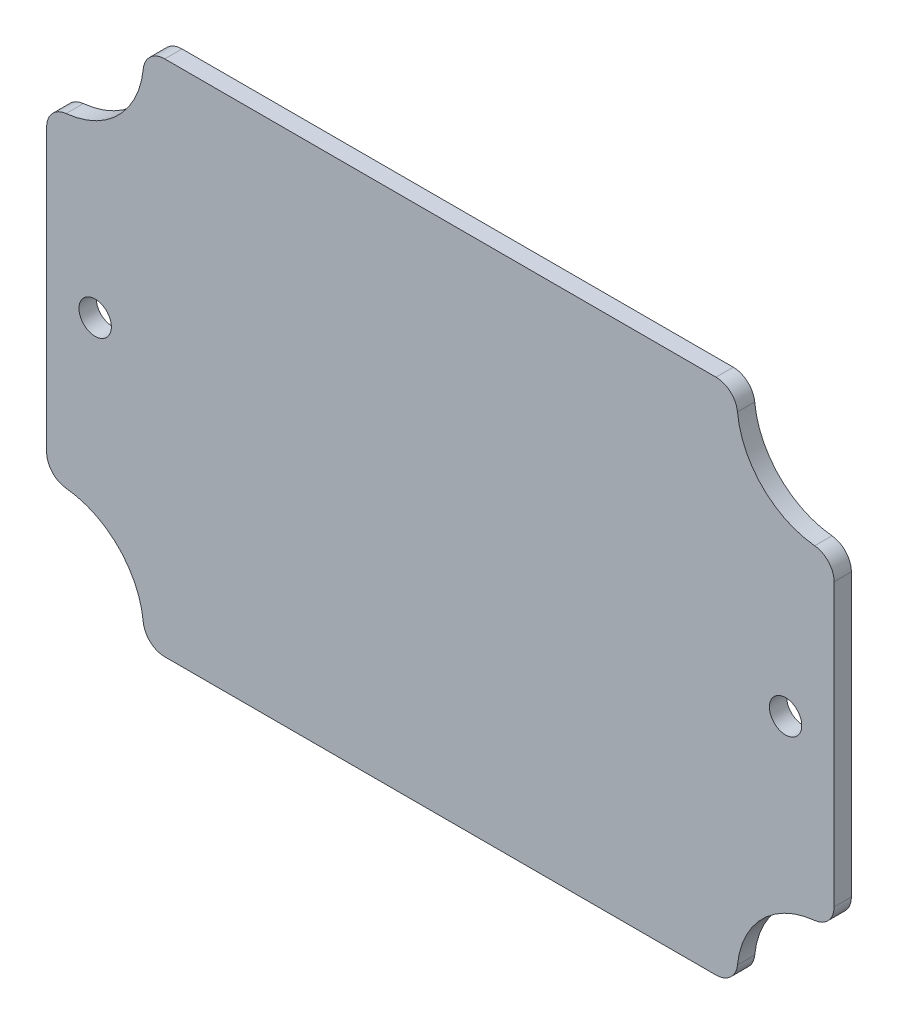
ISO-10303-21;
HEADER;
FILE_DESCRIPTION(('STEP AP214'),'2;1');
FILE_NAME('part.step','',(''),(''),'','','');
FILE_SCHEMA(('AUTOMOTIVE_DESIGN { 1 0 10303 214 1 1 1 1 }'));
ENDSEC;
DATA;
#1=APPLICATION_CONTEXT('core data for automotive mechanical design processes');
#2=APPLICATION_PROTOCOL_DEFINITION('international standard','automotive_design',2000,#1);
#3=PRODUCT_CONTEXT('',#1,'mechanical');
#4=PRODUCT('Part','Part','',(#3));
#5=PRODUCT_RELATED_PRODUCT_CATEGORY('part','',(#4));
#6=PRODUCT_DEFINITION_FORMATION('','',#4);
#7=PRODUCT_DEFINITION_CONTEXT('part definition',#1,'design');
#8=PRODUCT_DEFINITION('design','',#6,#7);
#9=PRODUCT_DEFINITION_SHAPE('','',#8);
#10=(LENGTH_UNIT() NAMED_UNIT(*) SI_UNIT(.MILLI.,.METRE.));
#11=(NAMED_UNIT(*) PLANE_ANGLE_UNIT() SI_UNIT($,.RADIAN.));
#12=(NAMED_UNIT(*) SI_UNIT($,.STERADIAN.) SOLID_ANGLE_UNIT());
#13=UNCERTAINTY_MEASURE_WITH_UNIT(LENGTH_MEASURE(1.E-05),#10,'distance_accuracy_value','');
#14=(GEOMETRIC_REPRESENTATION_CONTEXT(3) GLOBAL_UNCERTAINTY_ASSIGNED_CONTEXT((#13)) GLOBAL_UNIT_ASSIGNED_CONTEXT((#10,
#11,#12)) REPRESENTATION_CONTEXT('',''));
#15=CARTESIAN_POINT('',(0.,0.,0.));
#16=DIRECTION('',(0.,0.,1.));
#17=DIRECTION('',(1.,0.,0.));
#18=AXIS2_PLACEMENT_3D('',#15,#16,#17);
#19=CARTESIAN_POINT('',(0.,0.,1.6));
#20=DIRECTION('',(0.,0.,1.));
#21=DIRECTION('',(1.,0.,0.));
#22=AXIS2_PLACEMENT_3D('',#19,#20,#21);
#23=PLANE('',#22);
#24=CARTESIAN_POINT('',(-32.,0.,1.6));
#25=DIRECTION('',(0.,0.,1.));
#26=DIRECTION('',(1.,0.,0.));
#27=AXIS2_PLACEMENT_3D('',#24,#25,#26);
#28=CIRCLE('',#27,1.5);
#29=CARTESIAN_POINT('',(-30.5,0.,1.6));
#30=VERTEX_POINT('',#29);
#31=EDGE_CURVE('E293',#30,#30,#28,.T.);
#32=ORIENTED_EDGE('',*,*,#31,.F.);
#33=EDGE_LOOP('',(#32));
#34=FACE_BOUND('',#33,.T.);
#35=CARTESIAN_POINT('',(32.,0.,1.6));
#36=DIRECTION('',(0.,0.,1.));
#37=DIRECTION('',(1.,0.,0.));
#38=AXIS2_PLACEMENT_3D('',#35,#36,#37);
#39=CIRCLE('',#38,1.5);
#40=CARTESIAN_POINT('',(33.5,0.,1.6));
#41=VERTEX_POINT('',#40);
#42=EDGE_CURVE('E290',#41,#41,#39,.T.);
#43=ORIENTED_EDGE('',*,*,#42,.F.);
#44=EDGE_LOOP('',(#43));
#45=FACE_BOUND('',#44,.T.);
#46=DIRECTION('',(1.,0.,0.));
#47=VECTOR('',#46,1.);
#48=CARTESIAN_POINT('',(-36.5,-24.,1.6));
#49=LINE('',#48,#47);
#50=CARTESIAN_POINT('',(-25.5501256289338,-24.,1.6));
#51=VERTEX_POINT('',#50);
#52=CARTESIAN_POINT('',(25.5501256289338,-24.,1.6));
#53=VERTEX_POINT('',#52);
#54=EDGE_CURVE('E160',#51,#53,#49,.T.);
#55=ORIENTED_EDGE('',*,*,#54,.T.);
#56=CARTESIAN_POINT('',(25.5501256289338,-22.,1.6));
#57=DIRECTION('',(0.,0.,1.));
#58=DIRECTION('',(1.,0.,0.));
#59=AXIS2_PLACEMENT_3D('',#56,#57,#58);
#60=CIRCLE('',#59,2.);
#61=CARTESIAN_POINT('',(27.5401005031471,-22.2,1.6));
#62=VERTEX_POINT('',#61);
#63=EDGE_CURVE('E238',#53,#62,#60,.T.);
#64=ORIENTED_EDGE('',*,*,#63,.T.);
#65=CARTESIAN_POINT('',(35.5,-23.,1.6));
#66=DIRECTION('',(0.,0.,1.));
#67=DIRECTION('',(-1.,0.,0.));
#68=AXIS2_PLACEMENT_3D('',#65,#66,#67);
#69=CIRCLE('',#68,8.);
#70=CARTESIAN_POINT('',(34.7,-15.040100503147,1.6));
#71=VERTEX_POINT('',#70);
#72=EDGE_CURVE('E282',#71,#62,#69,.T.);
#73=ORIENTED_EDGE('',*,*,#72,.F.);
#74=CARTESIAN_POINT('',(34.5,-13.0501256289338,1.6));
#75=DIRECTION('',(0.,0.,1.));
#76=DIRECTION('',(1.,0.,0.));
#77=AXIS2_PLACEMENT_3D('',#74,#75,#76);
#78=CIRCLE('',#77,2.);
#79=CARTESIAN_POINT('',(36.5,-13.0501256289338,1.6));
#80=VERTEX_POINT('',#79);
#81=EDGE_CURVE('E240',#71,#80,#78,.T.);
#82=ORIENTED_EDGE('',*,*,#81,.T.);
#83=DIRECTION('',(0.,1.,0.));
#84=VECTOR('',#83,1.);
#85=CARTESIAN_POINT('',(36.5,24.,1.6));
#86=LINE('',#85,#84);
#87=CARTESIAN_POINT('',(36.5,13.0501256289338,1.6));
#88=VERTEX_POINT('',#87);
#89=EDGE_CURVE('E264',#80,#88,#86,.T.);
#90=ORIENTED_EDGE('',*,*,#89,.T.);
#91=CARTESIAN_POINT('',(34.5,13.0501256289338,1.6));
#92=DIRECTION('',(0.,0.,1.));
#93=DIRECTION('',(1.,0.,0.));
#94=AXIS2_PLACEMENT_3D('',#91,#92,#93);
#95=CIRCLE('',#94,2.);
#96=CARTESIAN_POINT('',(34.7,15.040100503147,1.6));
#97=VERTEX_POINT('',#96);
#98=EDGE_CURVE('E242',#88,#97,#95,.T.);
#99=ORIENTED_EDGE('',*,*,#98,.T.);
#100=CARTESIAN_POINT('',(35.5,23.,1.6));
#101=DIRECTION('',(0.,0.,-1.));
#102=DIRECTION('',(-1.,0.,0.));
#103=AXIS2_PLACEMENT_3D('',#100,#101,#102);
#104=CIRCLE('',#103,8.);
#105=CARTESIAN_POINT('',(27.5401005031471,22.2,1.6));
#106=VERTEX_POINT('',#105);
#107=EDGE_CURVE('E277',#97,#106,#104,.T.);
#108=ORIENTED_EDGE('',*,*,#107,.T.);
#109=CARTESIAN_POINT('',(25.5501256289338,22.,1.6));
#110=DIRECTION('',(0.,0.,1.));
#111=DIRECTION('',(1.,0.,0.));
#112=AXIS2_PLACEMENT_3D('',#109,#110,#111);
#113=CIRCLE('',#112,2.);
#114=CARTESIAN_POINT('',(25.5501256289338,24.,1.6));
#115=VERTEX_POINT('',#114);
#116=EDGE_CURVE('E244',#106,#115,#113,.T.);
#117=ORIENTED_EDGE('',*,*,#116,.T.);
#118=DIRECTION('',(-1.,0.,0.));
#119=VECTOR('',#118,1.);
#120=CARTESIAN_POINT('',(-36.5,24.,1.6));
#121=LINE('',#120,#119);
#122=CARTESIAN_POINT('',(-25.5501256289338,24.,1.6));
#123=VERTEX_POINT('',#122);
#124=EDGE_CURVE('E164',#115,#123,#121,.T.);
#125=ORIENTED_EDGE('',*,*,#124,.T.);
#126=CARTESIAN_POINT('',(-25.5501256289338,22.,1.6));
#127=DIRECTION('',(0.,0.,1.));
#128=DIRECTION('',(1.,0.,0.));
#129=AXIS2_PLACEMENT_3D('',#126,#127,#128);
#130=CIRCLE('',#129,2.);
#131=CARTESIAN_POINT('',(-27.5401005031471,22.2,1.6));
#132=VERTEX_POINT('',#131);
#133=EDGE_CURVE('E252',#123,#132,#130,.T.);
#134=ORIENTED_EDGE('',*,*,#133,.T.);
#135=CARTESIAN_POINT('',(-35.5,23.,1.6));
#136=DIRECTION('',(0.,0.,1.));
#137=DIRECTION('',(1.,0.,0.));
#138=AXIS2_PLACEMENT_3D('',#135,#136,#137);
#139=CIRCLE('',#138,8.);
#140=CARTESIAN_POINT('',(-34.7,15.040100503147,1.6));
#141=VERTEX_POINT('',#140);
#142=EDGE_CURVE('E222',#141,#132,#139,.T.);
#143=ORIENTED_EDGE('',*,*,#142,.F.);
#144=CARTESIAN_POINT('',(-34.5,13.0501256289338,1.6));
#145=DIRECTION('',(0.,0.,1.));
#146=DIRECTION('',(1.,0.,0.));
#147=AXIS2_PLACEMENT_3D('',#144,#145,#146);
#148=CIRCLE('',#147,2.);
#149=CARTESIAN_POINT('',(-36.5,13.0501256289338,1.6));
#150=VERTEX_POINT('',#149);
#151=EDGE_CURVE('E250',#141,#150,#148,.T.);
#152=ORIENTED_EDGE('',*,*,#151,.T.);
#153=DIRECTION('',(0.,-1.,0.));
#154=VECTOR('',#153,1.);
#155=CARTESIAN_POINT('',(-36.5,24.,1.6));
#156=LINE('',#155,#154);
#157=CARTESIAN_POINT('',(-36.5,-13.0501256289338,1.6));
#158=VERTEX_POINT('',#157);
#159=EDGE_CURVE('E257',#150,#158,#156,.T.);
#160=ORIENTED_EDGE('',*,*,#159,.T.);
#161=CARTESIAN_POINT('',(-34.5,-13.0501256289338,1.6));
#162=DIRECTION('',(0.,0.,1.));
#163=DIRECTION('',(1.,0.,0.));
#164=AXIS2_PLACEMENT_3D('',#161,#162,#163);
#165=CIRCLE('',#164,2.);
#166=CARTESIAN_POINT('',(-34.7,-15.040100503147,1.6));
#167=VERTEX_POINT('',#166);
#168=EDGE_CURVE('E248',#158,#167,#165,.T.);
#169=ORIENTED_EDGE('',*,*,#168,.T.);
#170=CARTESIAN_POINT('',(-35.5,-23.,1.6));
#171=DIRECTION('',(0.,0.,-1.));
#172=DIRECTION('',(1.,0.,0.));
#173=AXIS2_PLACEMENT_3D('',#170,#171,#172);
#174=CIRCLE('',#173,8.);
#175=CARTESIAN_POINT('',(-27.5401005031471,-22.2,1.6));
#176=VERTEX_POINT('',#175);
#177=EDGE_CURVE('E272',#167,#176,#174,.T.);
#178=ORIENTED_EDGE('',*,*,#177,.T.);
#179=CARTESIAN_POINT('',(-25.5501256289338,-22.,1.6));
#180=DIRECTION('',(0.,0.,1.));
#181=DIRECTION('',(1.,0.,0.));
#182=AXIS2_PLACEMENT_3D('',#179,#180,#181);
#183=CIRCLE('',#182,2.);
#184=EDGE_CURVE('E246',#176,#51,#183,.T.);
#185=ORIENTED_EDGE('',*,*,#184,.T.);
#186=EDGE_LOOP('',(#55,#64,#73,#82,#90,#99,#108,#117,#125,#134,#143,#152,#160,#169,#178,#185));
#187=FACE_BOUND('',#186,.T.);
#188=ADVANCED_FACE('F37',(#34,#45,#187),#23,.T.);
#189=CARTESIAN_POINT('',(0.,0.,0.));
#190=DIRECTION('',(0.,0.,1.));
#191=DIRECTION('',(1.,0.,0.));
#192=AXIS2_PLACEMENT_3D('',#189,#190,#191);
#193=PLANE('',#192);
#194=CARTESIAN_POINT('',(-32.,0.,0.));
#195=DIRECTION('',(0.,0.,1.));
#196=DIRECTION('',(1.,0.,0.));
#197=AXIS2_PLACEMENT_3D('',#194,#195,#196);
#198=CIRCLE('',#197,1.5);
#199=CARTESIAN_POINT('',(-30.5,0.,0.));
#200=VERTEX_POINT('',#199);
#201=EDGE_CURVE('E285',#200,#200,#198,.T.);
#202=ORIENTED_EDGE('',*,*,#201,.T.);
#203=EDGE_LOOP('',(#202));
#204=FACE_BOUND('',#203,.T.);
#205=CARTESIAN_POINT('',(32.,0.,0.));
#206=DIRECTION('',(0.,0.,1.));
#207=DIRECTION('',(1.,0.,0.));
#208=AXIS2_PLACEMENT_3D('',#205,#206,#207);
#209=CIRCLE('',#208,1.5);
#210=CARTESIAN_POINT('',(33.5,0.,0.));
#211=VERTEX_POINT('',#210);
#212=EDGE_CURVE('E287',#211,#211,#209,.T.);
#213=ORIENTED_EDGE('',*,*,#212,.T.);
#214=EDGE_LOOP('',(#213));
#215=FACE_BOUND('',#214,.T.);
#216=CARTESIAN_POINT('',(35.5,-23.,0.));
#217=DIRECTION('',(0.,0.,1.));
#218=DIRECTION('',(-1.,0.,0.));
#219=AXIS2_PLACEMENT_3D('',#216,#217,#218);
#220=CIRCLE('',#219,8.);
#221=CARTESIAN_POINT('',(34.7,-15.040100503147,0.));
#222=VERTEX_POINT('',#221);
#223=CARTESIAN_POINT('',(27.5401005031471,-22.2,0.));
#224=VERTEX_POINT('',#223);
#225=EDGE_CURVE('E280',#222,#224,#220,.T.);
#226=ORIENTED_EDGE('',*,*,#225,.T.);
#227=CARTESIAN_POINT('',(25.5501256289338,-22.,0.));
#228=DIRECTION('',(0.,0.,1.));
#229=DIRECTION('',(1.,0.,0.));
#230=AXIS2_PLACEMENT_3D('',#227,#228,#229);
#231=CIRCLE('',#230,2.);
#232=CARTESIAN_POINT('',(25.5501256289338,-24.,0.));
#233=VERTEX_POINT('',#232);
#234=EDGE_CURVE('E172',#224,#233,#231,.F.);
#235=ORIENTED_EDGE('',*,*,#234,.T.);
#236=DIRECTION('',(1.,0.,0.));
#237=VECTOR('',#236,1.);
#238=CARTESIAN_POINT('',(-36.5,-24.,0.));
#239=LINE('',#238,#237);
#240=CARTESIAN_POINT('',(-25.5501256289338,-24.,0.));
#241=VERTEX_POINT('',#240);
#242=EDGE_CURVE('E157',#241,#233,#239,.T.);
#243=ORIENTED_EDGE('',*,*,#242,.F.);
#244=CARTESIAN_POINT('',(-25.5501256289338,-22.,0.));
#245=DIRECTION('',(0.,0.,1.));
#246=DIRECTION('',(1.,0.,0.));
#247=AXIS2_PLACEMENT_3D('',#244,#245,#246);
#248=CIRCLE('',#247,2.);
#249=CARTESIAN_POINT('',(-27.5401005031471,-22.2,0.));
#250=VERTEX_POINT('',#249);
#251=EDGE_CURVE('E169',#241,#250,#248,.F.);
#252=ORIENTED_EDGE('',*,*,#251,.T.);
#253=CARTESIAN_POINT('',(-35.5,-23.,0.));
#254=DIRECTION('',(0.,0.,-1.));
#255=DIRECTION('',(1.,0.,0.));
#256=AXIS2_PLACEMENT_3D('',#253,#254,#255);
#257=CIRCLE('',#256,8.);
#258=CARTESIAN_POINT('',(-34.7,-15.040100503147,0.));
#259=VERTEX_POINT('',#258);
#260=EDGE_CURVE('E270',#259,#250,#257,.T.);
#261=ORIENTED_EDGE('',*,*,#260,.F.);
#262=CARTESIAN_POINT('',(-34.5,-13.0501256289338,0.));
#263=DIRECTION('',(0.,0.,1.));
#264=DIRECTION('',(1.,0.,0.));
#265=AXIS2_PLACEMENT_3D('',#262,#263,#264);
#266=CIRCLE('',#265,2.);
#267=CARTESIAN_POINT('',(-36.5,-13.0501256289338,0.));
#268=VERTEX_POINT('',#267);
#269=EDGE_CURVE('E180',#259,#268,#266,.F.);
#270=ORIENTED_EDGE('',*,*,#269,.T.);
#271=DIRECTION('',(0.,-1.,0.));
#272=VECTOR('',#271,1.);
#273=CARTESIAN_POINT('',(-36.5,24.,0.));
#274=LINE('',#273,#272);
#275=CARTESIAN_POINT('',(-36.5,13.0501256289338,0.));
#276=VERTEX_POINT('',#275);
#277=EDGE_CURVE('E174',#276,#268,#274,.T.);
#278=ORIENTED_EDGE('',*,*,#277,.F.);
#279=CARTESIAN_POINT('',(-34.5,13.0501256289338,0.));
#280=DIRECTION('',(0.,0.,1.));
#281=DIRECTION('',(1.,0.,0.));
#282=AXIS2_PLACEMENT_3D('',#279,#280,#281);
#283=CIRCLE('',#282,2.);
#284=CARTESIAN_POINT('',(-34.7,15.040100503147,0.));
#285=VERTEX_POINT('',#284);
#286=EDGE_CURVE('E184',#276,#285,#283,.F.);
#287=ORIENTED_EDGE('',*,*,#286,.T.);
#288=CARTESIAN_POINT('',(-35.5,23.,0.));
#289=DIRECTION('',(0.,0.,1.));
#290=DIRECTION('',(1.,0.,0.));
#291=AXIS2_PLACEMENT_3D('',#288,#289,#290);
#292=CIRCLE('',#291,8.);
#293=CARTESIAN_POINT('',(-27.5401005031471,22.2,0.));
#294=VERTEX_POINT('',#293);
#295=EDGE_CURVE('E219',#285,#294,#292,.T.);
#296=ORIENTED_EDGE('',*,*,#295,.T.);
#297=CARTESIAN_POINT('',(-25.5501256289338,22.,0.));
#298=DIRECTION('',(0.,0.,1.));
#299=DIRECTION('',(1.,0.,0.));
#300=AXIS2_PLACEMENT_3D('',#297,#298,#299);
#301=CIRCLE('',#300,2.);
#302=CARTESIAN_POINT('',(-25.5501256289338,24.,0.));
#303=VERTEX_POINT('',#302);
#304=EDGE_CURVE('E225',#294,#303,#301,.F.);
#305=ORIENTED_EDGE('',*,*,#304,.T.);
#306=DIRECTION('',(-1.,0.,0.));
#307=VECTOR('',#306,1.);
#308=CARTESIAN_POINT('',(-36.5,24.,0.));
#309=LINE('',#308,#307);
#310=CARTESIAN_POINT('',(25.5501256289338,24.,0.));
#311=VERTEX_POINT('',#310);
#312=EDGE_CURVE('E255',#311,#303,#309,.T.);
#313=ORIENTED_EDGE('',*,*,#312,.F.);
#314=CARTESIAN_POINT('',(25.5501256289338,22.,0.));
#315=DIRECTION('',(0.,0.,1.));
#316=DIRECTION('',(1.,0.,0.));
#317=AXIS2_PLACEMENT_3D('',#314,#315,#316);
#318=CIRCLE('',#317,2.);
#319=CARTESIAN_POINT('',(27.5401005031471,22.2,0.));
#320=VERTEX_POINT('',#319);
#321=EDGE_CURVE('E52',#311,#320,#318,.F.);
#322=ORIENTED_EDGE('',*,*,#321,.T.);
#323=CARTESIAN_POINT('',(35.5,23.,0.));
#324=DIRECTION('',(0.,0.,-1.));
#325=DIRECTION('',(-1.,0.,0.));
#326=AXIS2_PLACEMENT_3D('',#323,#324,#325);
#327=CIRCLE('',#326,8.);
#328=CARTESIAN_POINT('',(34.7,15.040100503147,0.));
#329=VERTEX_POINT('',#328);
#330=EDGE_CURVE('E275',#329,#320,#327,.T.);
#331=ORIENTED_EDGE('',*,*,#330,.F.);
#332=CARTESIAN_POINT('',(34.5,13.0501256289338,0.));
#333=DIRECTION('',(0.,0.,1.));
#334=DIRECTION('',(1.,0.,0.));
#335=AXIS2_PLACEMENT_3D('',#332,#333,#334);
#336=CIRCLE('',#335,2.);
#337=CARTESIAN_POINT('',(36.5,13.0501256289338,0.));
#338=VERTEX_POINT('',#337);
#339=EDGE_CURVE('E182',#329,#338,#336,.F.);
#340=ORIENTED_EDGE('',*,*,#339,.T.);
#341=DIRECTION('',(0.,1.,0.));
#342=VECTOR('',#341,1.);
#343=CARTESIAN_POINT('',(36.5,24.,0.));
#344=LINE('',#343,#342);
#345=CARTESIAN_POINT('',(36.5,-13.0501256289338,0.));
#346=VERTEX_POINT('',#345);
#347=EDGE_CURVE('E173',#346,#338,#344,.T.);
#348=ORIENTED_EDGE('',*,*,#347,.F.);
#349=CARTESIAN_POINT('',(34.5,-13.0501256289338,0.));
#350=DIRECTION('',(0.,0.,1.));
#351=DIRECTION('',(1.,0.,0.));
#352=AXIS2_PLACEMENT_3D('',#349,#350,#351);
#353=CIRCLE('',#352,2.);
#354=EDGE_CURVE('E189',#346,#222,#353,.F.);
#355=ORIENTED_EDGE('',*,*,#354,.T.);
#356=EDGE_LOOP('',(#226,#235,#243,#252,#261,#270,#278,#287,#296,#305,#313,#322,#331,#340,#348,#355));
#357=FACE_BOUND('',#356,.T.);
#358=ADVANCED_FACE('F167',(#204,#215,#357),#193,.F.);
#359=CARTESIAN_POINT('',(36.5,24.,1.6));
#360=DIRECTION('',(-1.,0.,0.));
#361=DIRECTION('',(0.,0.,1.));
#362=AXIS2_PLACEMENT_3D('',#359,#360,#361);
#363=PLANE('',#362);
#364=ORIENTED_EDGE('',*,*,#89,.F.);
#365=DIRECTION('',(0.,0.,1.));
#366=VECTOR('',#365,1.);
#367=CARTESIAN_POINT('',(36.5,-13.0501256289338,1.6));
#368=LINE('',#367,#366);
#369=EDGE_CURVE('E195',#80,#346,#368,.F.);
#370=ORIENTED_EDGE('',*,*,#369,.T.);
#371=ORIENTED_EDGE('',*,*,#347,.T.);
#372=DIRECTION('',(0.,0.,-1.));
#373=VECTOR('',#372,1.);
#374=CARTESIAN_POINT('',(36.5,13.0501256289338,1.6));
#375=LINE('',#374,#373);
#376=EDGE_CURVE('E192',#338,#88,#375,.F.);
#377=ORIENTED_EDGE('',*,*,#376,.T.);
#378=EDGE_LOOP('',(#364,#370,#371,#377));
#379=FACE_BOUND('',#378,.T.);
#380=ADVANCED_FACE('F359',(#379),#363,.F.);
#381=CARTESIAN_POINT('',(-36.5,24.,1.6));
#382=DIRECTION('',(0.,-1.,0.));
#383=DIRECTION('',(0.,0.,-1.));
#384=AXIS2_PLACEMENT_3D('',#381,#382,#383);
#385=PLANE('',#384);
#386=ORIENTED_EDGE('',*,*,#124,.F.);
#387=DIRECTION('',(0.,0.,-1.));
#388=VECTOR('',#387,1.);
#389=CARTESIAN_POINT('',(25.5501256289338,24.,0.));
#390=LINE('',#389,#388);
#391=EDGE_CURVE('E204',#115,#311,#390,.T.);
#392=ORIENTED_EDGE('',*,*,#391,.T.);
#393=ORIENTED_EDGE('',*,*,#312,.T.);
#394=DIRECTION('',(0.,0.,1.));
#395=VECTOR('',#394,1.);
#396=CARTESIAN_POINT('',(-25.5501256289338,24.,1.6));
#397=LINE('',#396,#395);
#398=EDGE_CURVE('E201',#303,#123,#397,.T.);
#399=ORIENTED_EDGE('',*,*,#398,.T.);
#400=EDGE_LOOP('',(#386,#392,#393,#399));
#401=FACE_BOUND('',#400,.T.);
#402=ADVANCED_FACE('F356',(#401),#385,.F.);
#403=CARTESIAN_POINT('',(-36.5,24.,1.6));
#404=DIRECTION('',(1.,0.,0.));
#405=DIRECTION('',(0.,0.,-1.));
#406=AXIS2_PLACEMENT_3D('',#403,#404,#405);
#407=PLANE('',#406);
#408=ORIENTED_EDGE('',*,*,#277,.T.);
#409=DIRECTION('',(0.,0.,-1.));
#410=VECTOR('',#409,1.);
#411=CARTESIAN_POINT('',(-36.5,-13.0501256289338,1.6));
#412=LINE('',#411,#410);
#413=EDGE_CURVE('E211',#268,#158,#412,.F.);
#414=ORIENTED_EDGE('',*,*,#413,.T.);
#415=ORIENTED_EDGE('',*,*,#159,.F.);
#416=DIRECTION('',(0.,0.,1.));
#417=VECTOR('',#416,1.);
#418=CARTESIAN_POINT('',(-36.5,13.0501256289338,1.6));
#419=LINE('',#418,#417);
#420=EDGE_CURVE('E209',#150,#276,#419,.F.);
#421=ORIENTED_EDGE('',*,*,#420,.T.);
#422=EDGE_LOOP('',(#408,#414,#415,#421));
#423=FACE_BOUND('',#422,.T.);
#424=ADVANCED_FACE('F324',(#423),#407,.F.);
#425=CARTESIAN_POINT('',(-36.5,-24.,1.6));
#426=DIRECTION('',(0.,1.,0.));
#427=DIRECTION('',(0.,0.,1.));
#428=AXIS2_PLACEMENT_3D('',#425,#426,#427);
#429=PLANE('',#428);
#430=ORIENTED_EDGE('',*,*,#242,.T.);
#431=DIRECTION('',(0.,0.,1.));
#432=VECTOR('',#431,1.);
#433=CARTESIAN_POINT('',(25.5501256289338,-24.,1.6));
#434=LINE('',#433,#432);
#435=EDGE_CURVE('E163',#233,#53,#434,.T.);
#436=ORIENTED_EDGE('',*,*,#435,.T.);
#437=ORIENTED_EDGE('',*,*,#54,.F.);
#438=DIRECTION('',(0.,0.,-1.));
#439=VECTOR('',#438,1.);
#440=CARTESIAN_POINT('',(-25.5501256289338,-24.,0.));
#441=LINE('',#440,#439);
#442=EDGE_CURVE('E153',#51,#241,#441,.T.);
#443=ORIENTED_EDGE('',*,*,#442,.T.);
#444=EDGE_LOOP('',(#430,#436,#437,#443));
#445=FACE_BOUND('',#444,.T.);
#446=ADVANCED_FACE('F155',(#445),#429,.F.);
#447=CARTESIAN_POINT('',(-35.5,23.,0.));
#448=DIRECTION('',(0.,0.,1.));
#449=DIRECTION('',(1.,0.,0.));
#450=AXIS2_PLACEMENT_3D('',#447,#448,#449);
#451=CYLINDRICAL_SURFACE('',#450,8.);
#452=ORIENTED_EDGE('',*,*,#295,.F.);
#453=DIRECTION('',(0.,0.,1.));
#454=VECTOR('',#453,1.);
#455=CARTESIAN_POINT('',(-34.7,15.040100503147,0.));
#456=LINE('',#455,#454);
#457=EDGE_CURVE('E11',#285,#141,#456,.T.);
#458=ORIENTED_EDGE('',*,*,#457,.T.);
#459=ORIENTED_EDGE('',*,*,#142,.T.);
#460=DIRECTION('',(0.,0.,1.));
#461=VECTOR('',#460,1.);
#462=CARTESIAN_POINT('',(-27.5401005031471,22.2,0.));
#463=LINE('',#462,#461);
#464=EDGE_CURVE('E45',#132,#294,#463,.F.);
#465=ORIENTED_EDGE('',*,*,#464,.T.);
#466=EDGE_LOOP('',(#452,#458,#459,#465));
#467=FACE_BOUND('',#466,.T.);
#468=ADVANCED_FACE('F218',(#467),#451,.F.);
#469=CARTESIAN_POINT('',(-35.5,-23.,0.));
#470=DIRECTION('',(0.,0.,1.));
#471=DIRECTION('',(1.,0.,0.));
#472=AXIS2_PLACEMENT_3D('',#469,#470,#471);
#473=CYLINDRICAL_SURFACE('',#472,8.);
#474=ORIENTED_EDGE('',*,*,#260,.T.);
#475=DIRECTION('',(0.,0.,1.));
#476=VECTOR('',#475,1.);
#477=CARTESIAN_POINT('',(-27.5401005031471,-22.2,0.));
#478=LINE('',#477,#476);
#479=EDGE_CURVE('E179',#250,#176,#478,.T.);
#480=ORIENTED_EDGE('',*,*,#479,.T.);
#481=ORIENTED_EDGE('',*,*,#177,.F.);
#482=DIRECTION('',(0.,0.,1.));
#483=VECTOR('',#482,1.);
#484=CARTESIAN_POINT('',(-34.7,-15.040100503147,0.));
#485=LINE('',#484,#483);
#486=EDGE_CURVE('E206',#167,#259,#485,.F.);
#487=ORIENTED_EDGE('',*,*,#486,.T.);
#488=EDGE_LOOP('',(#474,#480,#481,#487));
#489=FACE_BOUND('',#488,.T.);
#490=ADVANCED_FACE('F316',(#489),#473,.F.);
#491=CARTESIAN_POINT('',(35.5,23.,0.));
#492=DIRECTION('',(0.,0.,1.));
#493=DIRECTION('',(1.,0.,0.));
#494=AXIS2_PLACEMENT_3D('',#491,#492,#493);
#495=CYLINDRICAL_SURFACE('',#494,8.);
#496=ORIENTED_EDGE('',*,*,#107,.F.);
#497=DIRECTION('',(0.,0.,1.));
#498=VECTOR('',#497,1.);
#499=CARTESIAN_POINT('',(34.7,15.040100503147,0.));
#500=LINE('',#499,#498);
#501=EDGE_CURVE('E59',#97,#329,#500,.F.);
#502=ORIENTED_EDGE('',*,*,#501,.T.);
#503=ORIENTED_EDGE('',*,*,#330,.T.);
#504=DIRECTION('',(0.,0.,1.));
#505=VECTOR('',#504,1.);
#506=CARTESIAN_POINT('',(27.5401005031471,22.2,0.));
#507=LINE('',#506,#505);
#508=EDGE_CURVE('E197',#320,#106,#507,.T.);
#509=ORIENTED_EDGE('',*,*,#508,.T.);
#510=EDGE_LOOP('',(#496,#502,#503,#509));
#511=FACE_BOUND('',#510,.T.);
#512=ADVANCED_FACE('F372',(#511),#495,.F.);
#513=CARTESIAN_POINT('',(35.5,-23.,0.));
#514=DIRECTION('',(0.,0.,1.));
#515=DIRECTION('',(1.,0.,0.));
#516=AXIS2_PLACEMENT_3D('',#513,#514,#515);
#517=CYLINDRICAL_SURFACE('',#516,8.);
#518=ORIENTED_EDGE('',*,*,#72,.T.);
#519=DIRECTION('',(0.,0.,1.));
#520=VECTOR('',#519,1.);
#521=CARTESIAN_POINT('',(27.5401005031471,-22.2,0.));
#522=LINE('',#521,#520);
#523=EDGE_CURVE('E231',#62,#224,#522,.F.);
#524=ORIENTED_EDGE('',*,*,#523,.T.);
#525=ORIENTED_EDGE('',*,*,#225,.F.);
#526=DIRECTION('',(0.,0.,1.));
#527=VECTOR('',#526,1.);
#528=CARTESIAN_POINT('',(34.7,-15.040100503147,0.));
#529=LINE('',#528,#527);
#530=EDGE_CURVE('E233',#222,#71,#529,.T.);
#531=ORIENTED_EDGE('',*,*,#530,.T.);
#532=EDGE_LOOP('',(#518,#524,#525,#531));
#533=FACE_BOUND('',#532,.T.);
#534=ADVANCED_FACE('F352',(#533),#517,.F.);
#535=CARTESIAN_POINT('',(25.5501256289338,-22.,0.));
#536=DIRECTION('',(0.,0.,1.));
#537=DIRECTION('',(1.,0.,0.));
#538=AXIS2_PLACEMENT_3D('',#535,#536,#537);
#539=CYLINDRICAL_SURFACE('',#538,2.);
#540=ORIENTED_EDGE('',*,*,#234,.F.);
#541=ORIENTED_EDGE('',*,*,#523,.F.);
#542=ORIENTED_EDGE('',*,*,#63,.F.);
#543=ORIENTED_EDGE('',*,*,#435,.F.);
#544=EDGE_LOOP('',(#540,#541,#542,#543));
#545=FACE_BOUND('',#544,.T.);
#546=ADVANCED_FACE('F348',(#545),#539,.T.);
#547=CARTESIAN_POINT('',(34.5,-13.0501256289338,0.));
#548=DIRECTION('',(0.,0.,1.));
#549=DIRECTION('',(1.,0.,0.));
#550=AXIS2_PLACEMENT_3D('',#547,#548,#549);
#551=CYLINDRICAL_SURFACE('',#550,2.);
#552=ORIENTED_EDGE('',*,*,#354,.F.);
#553=ORIENTED_EDGE('',*,*,#369,.F.);
#554=ORIENTED_EDGE('',*,*,#81,.F.);
#555=ORIENTED_EDGE('',*,*,#530,.F.);
#556=EDGE_LOOP('',(#552,#553,#554,#555));
#557=FACE_BOUND('',#556,.T.);
#558=ADVANCED_FACE('F344',(#557),#551,.T.);
#559=CARTESIAN_POINT('',(34.5,13.0501256289338,0.));
#560=DIRECTION('',(0.,0.,1.));
#561=DIRECTION('',(1.,0.,0.));
#562=AXIS2_PLACEMENT_3D('',#559,#560,#561);
#563=CYLINDRICAL_SURFACE('',#562,2.);
#564=ORIENTED_EDGE('',*,*,#339,.F.);
#565=ORIENTED_EDGE('',*,*,#501,.F.);
#566=ORIENTED_EDGE('',*,*,#98,.F.);
#567=ORIENTED_EDGE('',*,*,#376,.F.);
#568=EDGE_LOOP('',(#564,#565,#566,#567));
#569=FACE_BOUND('',#568,.T.);
#570=ADVANCED_FACE('F340',(#569),#563,.T.);
#571=CARTESIAN_POINT('',(25.5501256289338,22.,0.));
#572=DIRECTION('',(0.,0.,1.));
#573=DIRECTION('',(1.,0.,0.));
#574=AXIS2_PLACEMENT_3D('',#571,#572,#573);
#575=CYLINDRICAL_SURFACE('',#574,2.);
#576=ORIENTED_EDGE('',*,*,#321,.F.);
#577=ORIENTED_EDGE('',*,*,#391,.F.);
#578=ORIENTED_EDGE('',*,*,#116,.F.);
#579=ORIENTED_EDGE('',*,*,#508,.F.);
#580=EDGE_LOOP('',(#576,#577,#578,#579));
#581=FACE_BOUND('',#580,.T.);
#582=ADVANCED_FACE('F337',(#581),#575,.T.);
#583=CARTESIAN_POINT('',(-25.5501256289338,-22.,0.));
#584=DIRECTION('',(0.,0.,1.));
#585=DIRECTION('',(1.,0.,0.));
#586=AXIS2_PLACEMENT_3D('',#583,#584,#585);
#587=CYLINDRICAL_SURFACE('',#586,2.);
#588=ORIENTED_EDGE('',*,*,#251,.F.);
#589=ORIENTED_EDGE('',*,*,#442,.F.);
#590=ORIENTED_EDGE('',*,*,#184,.F.);
#591=ORIENTED_EDGE('',*,*,#479,.F.);
#592=EDGE_LOOP('',(#588,#589,#590,#591));
#593=FACE_BOUND('',#592,.T.);
#594=ADVANCED_FACE('F177',(#593),#587,.T.);
#595=CARTESIAN_POINT('',(-34.5,-13.0501256289338,0.));
#596=DIRECTION('',(0.,0.,1.));
#597=DIRECTION('',(1.,0.,0.));
#598=AXIS2_PLACEMENT_3D('',#595,#596,#597);
#599=CYLINDRICAL_SURFACE('',#598,2.);
#600=ORIENTED_EDGE('',*,*,#269,.F.);
#601=ORIENTED_EDGE('',*,*,#486,.F.);
#602=ORIENTED_EDGE('',*,*,#168,.F.);
#603=ORIENTED_EDGE('',*,*,#413,.F.);
#604=EDGE_LOOP('',(#600,#601,#602,#603));
#605=FACE_BOUND('',#604,.T.);
#606=ADVANCED_FACE('F321',(#605),#599,.T.);
#607=CARTESIAN_POINT('',(-34.5,13.0501256289338,0.));
#608=DIRECTION('',(0.,0.,1.));
#609=DIRECTION('',(1.,0.,0.));
#610=AXIS2_PLACEMENT_3D('',#607,#608,#609);
#611=CYLINDRICAL_SURFACE('',#610,2.);
#612=ORIENTED_EDGE('',*,*,#286,.F.);
#613=ORIENTED_EDGE('',*,*,#420,.F.);
#614=ORIENTED_EDGE('',*,*,#151,.F.);
#615=ORIENTED_EDGE('',*,*,#457,.F.);
#616=EDGE_LOOP('',(#612,#613,#614,#615));
#617=FACE_BOUND('',#616,.T.);
#618=ADVANCED_FACE('F327',(#617),#611,.T.);
#619=CARTESIAN_POINT('',(-25.5501256289338,22.,0.));
#620=DIRECTION('',(0.,0.,1.));
#621=DIRECTION('',(1.,0.,0.));
#622=AXIS2_PLACEMENT_3D('',#619,#620,#621);
#623=CYLINDRICAL_SURFACE('',#622,2.);
#624=ORIENTED_EDGE('',*,*,#304,.F.);
#625=ORIENTED_EDGE('',*,*,#464,.F.);
#626=ORIENTED_EDGE('',*,*,#133,.F.);
#627=ORIENTED_EDGE('',*,*,#398,.F.);
#628=EDGE_LOOP('',(#624,#625,#626,#627));
#629=FACE_BOUND('',#628,.T.);
#630=ADVANCED_FACE('F39',(#629),#623,.T.);
#631=CARTESIAN_POINT('',(32.,0.,0.));
#632=DIRECTION('',(0.,0.,1.));
#633=DIRECTION('',(1.,0.,0.));
#634=AXIS2_PLACEMENT_3D('',#631,#632,#633);
#635=CYLINDRICAL_SURFACE('',#634,1.5);
#636=ORIENTED_EDGE('',*,*,#212,.F.);
#637=EDGE_LOOP('',(#636));
#638=FACE_BOUND('',#637,.T.);
#639=ORIENTED_EDGE('',*,*,#42,.T.);
#640=EDGE_LOOP('',(#639));
#641=FACE_BOUND('',#640,.T.);
#642=ADVANCED_FACE('F304',(#638,#641),#635,.F.);
#643=CARTESIAN_POINT('',(-32.,0.,0.));
#644=DIRECTION('',(0.,0.,1.));
#645=DIRECTION('',(1.,0.,0.));
#646=AXIS2_PLACEMENT_3D('',#643,#644,#645);
#647=CYLINDRICAL_SURFACE('',#646,1.5);
#648=ORIENTED_EDGE('',*,*,#201,.F.);
#649=EDGE_LOOP('',(#648));
#650=FACE_BOUND('',#649,.T.);
#651=ORIENTED_EDGE('',*,*,#31,.T.);
#652=EDGE_LOOP('',(#651));
#653=FACE_BOUND('',#652,.T.);
#654=ADVANCED_FACE('F301',(#650,#653),#647,.F.);
#655=CLOSED_SHELL('',(#188,#358,#380,#402,#424,#446,#468,#490,#512,#534,#546,#558,#570,#582,
#594,#606,#618,#630,#642,#654));
#656=MANIFOLD_SOLID_BREP('B2',#655);
#657=ADVANCED_BREP_SHAPE_REPRESENTATION('',(#18,#656),#14);
#658=SHAPE_DEFINITION_REPRESENTATION(#9,#657);
ENDSEC;
END-ISO-10303-21;
